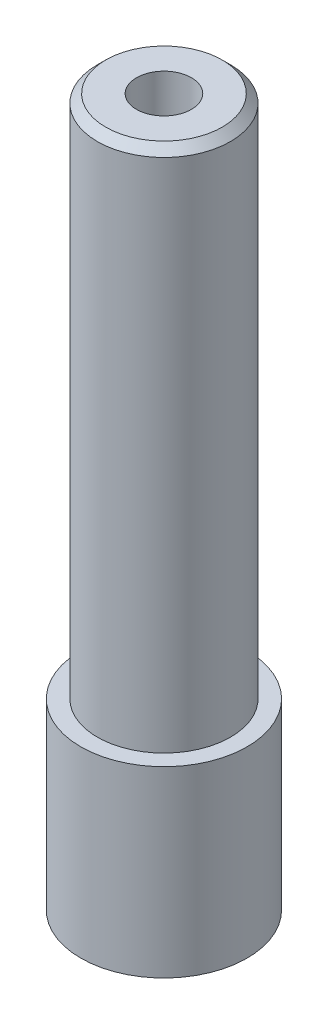
ISO-10303-21;
HEADER;
FILE_DESCRIPTION(('STEP AP214'),'2;1');
FILE_NAME('part.step','',(''),(''),'','','');
FILE_SCHEMA(('AUTOMOTIVE_DESIGN { 1 0 10303 214 1 1 1 1 }'));
ENDSEC;
DATA;
#1=APPLICATION_CONTEXT('core data for automotive mechanical design processes');
#2=APPLICATION_PROTOCOL_DEFINITION('international standard','automotive_design',2000,#1);
#3=PRODUCT_CONTEXT('',#1,'mechanical');
#4=PRODUCT('Part','Part','',(#3));
#5=PRODUCT_RELATED_PRODUCT_CATEGORY('part','',(#4));
#6=PRODUCT_DEFINITION_FORMATION('','',#4);
#7=PRODUCT_DEFINITION_CONTEXT('part definition',#1,'design');
#8=PRODUCT_DEFINITION('design','',#6,#7);
#9=PRODUCT_DEFINITION_SHAPE('','',#8);
#10=(LENGTH_UNIT() NAMED_UNIT(*) SI_UNIT(.MILLI.,.METRE.));
#11=(NAMED_UNIT(*) PLANE_ANGLE_UNIT() SI_UNIT($,.RADIAN.));
#12=(NAMED_UNIT(*) SI_UNIT($,.STERADIAN.) SOLID_ANGLE_UNIT());
#13=UNCERTAINTY_MEASURE_WITH_UNIT(LENGTH_MEASURE(1.E-05),#10,'distance_accuracy_value','');
#14=(GEOMETRIC_REPRESENTATION_CONTEXT(3) GLOBAL_UNCERTAINTY_ASSIGNED_CONTEXT((#13)) GLOBAL_UNIT_ASSIGNED_CONTEXT((#10,
#11,#12)) REPRESENTATION_CONTEXT('',''));
#15=CARTESIAN_POINT('',(0.,0.,0.));
#16=DIRECTION('',(0.,0.,1.));
#17=DIRECTION('',(1.,0.,0.));
#18=AXIS2_PLACEMENT_3D('',#15,#16,#17);
#19=CARTESIAN_POINT('',(0.,43.836200342449,0.));
#20=DIRECTION('',(0.,-1.,0.));
#21=DIRECTION('',(0.,0.,-1.));
#22=AXIS2_PLACEMENT_3D('',#19,#20,#21);
#23=CYLINDRICAL_SURFACE('',#22,8.);
#24=CARTESIAN_POINT('',(0.,42.836200342449,0.));
#25=DIRECTION('',(0.,1.,0.));
#26=DIRECTION('',(0.,0.,1.));
#27=AXIS2_PLACEMENT_3D('',#24,#25,#26);
#28=CIRCLE('',#27,8.);
#29=CARTESIAN_POINT('',(0.,42.836200342449,8.));
#30=VERTEX_POINT('',#29);
#31=EDGE_CURVE('E10',#30,#30,#28,.F.);
#32=ORIENTED_EDGE('',*,*,#31,.T.);
#33=EDGE_LOOP('',(#32));
#34=FACE_BOUND('',#33,.T.);
#35=CARTESIAN_POINT('',(0.,-19.163799657551,0.));
#36=DIRECTION('',(0.,-1.,0.));
#37=DIRECTION('',(0.,0.,-1.));
#38=AXIS2_PLACEMENT_3D('',#35,#36,#37);
#39=CIRCLE('',#38,8.);
#40=CARTESIAN_POINT('',(0.,-19.163799657551,-8.));
#41=VERTEX_POINT('',#40);
#42=EDGE_CURVE('E53',#41,#41,#39,.T.);
#43=ORIENTED_EDGE('',*,*,#42,.F.);
#44=EDGE_LOOP('',(#43));
#45=FACE_BOUND('',#44,.T.);
#46=ADVANCED_FACE('F41',(#34,#45),#23,.T.);
#47=CARTESIAN_POINT('',(0.,43.836200342449,0.));
#48=DIRECTION('',(0.,1.,0.));
#49=DIRECTION('',(0.,0.,1.));
#50=AXIS2_PLACEMENT_3D('',#47,#48,#49);
#51=PLANE('',#50);
#52=CARTESIAN_POINT('',(0.,43.836200342449,0.));
#53=DIRECTION('',(0.,1.,0.));
#54=DIRECTION('',(0.,0.,1.));
#55=AXIS2_PLACEMENT_3D('',#52,#53,#54);
#56=CIRCLE('',#55,3.3);
#57=CARTESIAN_POINT('',(0.,43.836200342449,3.3));
#58=VERTEX_POINT('',#57);
#59=EDGE_CURVE('E70',#58,#58,#56,.T.);
#60=ORIENTED_EDGE('',*,*,#59,.F.);
#61=EDGE_LOOP('',(#60));
#62=FACE_BOUND('',#61,.T.);
#63=CARTESIAN_POINT('',(0.,43.836200342449,0.));
#64=DIRECTION('',(0.,1.,0.));
#65=DIRECTION('',(0.,0.,1.));
#66=AXIS2_PLACEMENT_3D('',#63,#64,#65);
#67=CIRCLE('',#66,6.99999999999998);
#68=CARTESIAN_POINT('',(0.,43.836200342449,6.99999999999998));
#69=VERTEX_POINT('',#68);
#70=EDGE_CURVE('E49',#69,#69,#67,.T.);
#71=ORIENTED_EDGE('',*,*,#70,.T.);
#72=EDGE_LOOP('',(#71));
#73=FACE_BOUND('',#72,.T.);
#74=ADVANCED_FACE('F90',(#62,#73),#51,.T.);
#75=CARTESIAN_POINT('',(0.,43.836200342449,0.));
#76=DIRECTION('',(0.,1.,0.));
#77=DIRECTION('',(0.,0.,1.));
#78=AXIS2_PLACEMENT_3D('',#75,#76,#77);
#79=CYLINDRICAL_SURFACE('',#78,10.);
#80=CARTESIAN_POINT('',(0.,-19.163799657551,0.));
#81=DIRECTION('',(0.,1.,0.));
#82=DIRECTION('',(0.,0.,1.));
#83=AXIS2_PLACEMENT_3D('',#80,#81,#82);
#84=CIRCLE('',#83,10.);
#85=CARTESIAN_POINT('',(0.,-19.163799657551,10.));
#86=VERTEX_POINT('',#85);
#87=EDGE_CURVE('E61',#86,#86,#84,.T.);
#88=ORIENTED_EDGE('',*,*,#87,.F.);
#89=EDGE_LOOP('',(#88));
#90=FACE_BOUND('',#89,.T.);
#91=CARTESIAN_POINT('',(0.,-41.163799657551,0.));
#92=DIRECTION('',(0.,1.,0.));
#93=DIRECTION('',(0.,0.,1.));
#94=AXIS2_PLACEMENT_3D('',#91,#92,#93);
#95=CIRCLE('',#94,10.);
#96=CARTESIAN_POINT('',(0.,-41.163799657551,10.));
#97=VERTEX_POINT('',#96);
#98=EDGE_CURVE('E58',#97,#97,#95,.T.);
#99=ORIENTED_EDGE('',*,*,#98,.T.);
#100=EDGE_LOOP('',(#99));
#101=FACE_BOUND('',#100,.T.);
#102=ADVANCED_FACE('F94',(#90,#101),#79,.T.);
#103=CARTESIAN_POINT('',(10.,-19.163799657551,0.));
#104=DIRECTION('',(0.,-1.,0.));
#105=DIRECTION('',(0.,0.,-1.));
#106=AXIS2_PLACEMENT_3D('',#103,#104,#105);
#107=PLANE('',#106);
#108=ORIENTED_EDGE('',*,*,#42,.T.);
#109=EDGE_LOOP('',(#108));
#110=FACE_BOUND('',#109,.T.);
#111=ORIENTED_EDGE('',*,*,#87,.T.);
#112=EDGE_LOOP('',(#111));
#113=FACE_BOUND('',#112,.T.);
#114=ADVANCED_FACE('F101',(#110,#113),#107,.F.);
#115=CARTESIAN_POINT('',(0.,-41.163799657551,0.));
#116=DIRECTION('',(0.,1.,0.));
#117=DIRECTION('',(0.,0.,1.));
#118=AXIS2_PLACEMENT_3D('',#115,#116,#117);
#119=PLANE('',#118);
#120=CARTESIAN_POINT('',(0.,-41.163799657551,0.));
#121=DIRECTION('',(0.,-1.,0.));
#122=DIRECTION('',(0.,0.,-1.));
#123=AXIS2_PLACEMENT_3D('',#120,#121,#122);
#124=CIRCLE('',#123,4.99999999999998);
#125=CARTESIAN_POINT('',(0.,-41.163799657551,-4.99999999999998));
#126=VERTEX_POINT('',#125);
#127=EDGE_CURVE('E67',#126,#126,#124,.T.);
#128=ORIENTED_EDGE('',*,*,#127,.F.);
#129=EDGE_LOOP('',(#128));
#130=FACE_BOUND('',#129,.T.);
#131=ORIENTED_EDGE('',*,*,#98,.F.);
#132=EDGE_LOOP('',(#131));
#133=FACE_BOUND('',#132,.T.);
#134=ADVANCED_FACE('F99',(#130,#133),#119,.F.);
#135=CARTESIAN_POINT('',(0.,43.836200342449,0.));
#136=DIRECTION('',(0.,-1.,0.));
#137=DIRECTION('',(0.,0.,-1.));
#138=AXIS2_PLACEMENT_3D('',#135,#136,#137);
#139=CONICAL_SURFACE('',#138,6.99999999999998,0.785398163397448);
#140=ORIENTED_EDGE('',*,*,#31,.F.);
#141=EDGE_LOOP('',(#140));
#142=FACE_BOUND('',#141,.T.);
#143=ORIENTED_EDGE('',*,*,#70,.F.);
#144=EDGE_LOOP('',(#143));
#145=FACE_BOUND('',#144,.T.);
#146=ADVANCED_FACE('F43',(#142,#145),#139,.T.);
#147=CARTESIAN_POINT('',(0.,-5.16379965755097,0.));
#148=DIRECTION('',(0.,-1.,0.));
#149=DIRECTION('',(0.,0.,-1.));
#150=AXIS2_PLACEMENT_3D('',#147,#148,#149);
#151=CONICAL_SURFACE('',#150,4.99999999999999,1.02974425867665);
#152=CARTESIAN_POINT('',(0.,-4.14233660520411,0.));
#153=DIRECTION('',(0.,-1.,0.));
#154=DIRECTION('',(0.,0.,-1.));
#155=AXIS2_PLACEMENT_3D('',#152,#153,#154);
#156=CIRCLE('',#155,3.29999999999999);
#157=CARTESIAN_POINT('',(0.,-4.14233660520411,-3.29999999999999));
#158=VERTEX_POINT('',#157);
#159=EDGE_CURVE('E45',#158,#158,#156,.F.);
#160=ORIENTED_EDGE('',*,*,#159,.T.);
#161=EDGE_LOOP('',(#160));
#162=FACE_BOUND('',#161,.T.);
#163=CARTESIAN_POINT('',(0.,-5.16379965755097,0.));
#164=DIRECTION('',(0.,-1.,0.));
#165=DIRECTION('',(0.,0.,-1.));
#166=AXIS2_PLACEMENT_3D('',#163,#164,#165);
#167=CIRCLE('',#166,4.99999999999999);
#168=CARTESIAN_POINT('',(0.,-5.16379965755097,-4.99999999999999));
#169=VERTEX_POINT('',#168);
#170=EDGE_CURVE('E64',#169,#169,#167,.T.);
#171=ORIENTED_EDGE('',*,*,#170,.T.);
#172=EDGE_LOOP('',(#171));
#173=FACE_BOUND('',#172,.T.);
#174=ADVANCED_FACE('F77',(#162,#173),#151,.F.);
#175=CARTESIAN_POINT('',(0.,-41.163799657551,0.));
#176=DIRECTION('',(0.,-1.,0.));
#177=DIRECTION('',(0.,0.,-1.));
#178=AXIS2_PLACEMENT_3D('',#175,#176,#177);
#179=CYLINDRICAL_SURFACE('',#178,4.99999999999999);
#180=ORIENTED_EDGE('',*,*,#170,.F.);
#181=EDGE_LOOP('',(#180));
#182=FACE_BOUND('',#181,.T.);
#183=ORIENTED_EDGE('',*,*,#127,.T.);
#184=EDGE_LOOP('',(#183));
#185=FACE_BOUND('',#184,.T.);
#186=ADVANCED_FACE('F82',(#182,#185),#179,.F.);
#187=CARTESIAN_POINT('',(0.,43.836200342449,0.));
#188=DIRECTION('',(0.,1.,0.));
#189=DIRECTION('',(0.,0.,1.));
#190=AXIS2_PLACEMENT_3D('',#187,#188,#189);
#191=CYLINDRICAL_SURFACE('',#190,3.29999999999999);
#192=ORIENTED_EDGE('',*,*,#59,.T.);
#193=EDGE_LOOP('',(#192));
#194=FACE_BOUND('',#193,.T.);
#195=ORIENTED_EDGE('',*,*,#159,.F.);
#196=EDGE_LOOP('',(#195));
#197=FACE_BOUND('',#196,.T.);
#198=ADVANCED_FACE('F80',(#194,#197),#191,.F.);
#199=CLOSED_SHELL('',(#46,#74,#102,#114,#134,#146,#174,#186,#198));
#200=MANIFOLD_SOLID_BREP('B2',#199);
#201=ADVANCED_BREP_SHAPE_REPRESENTATION('',(#18,#200),#14);
#202=SHAPE_DEFINITION_REPRESENTATION(#9,#201);
ENDSEC;
END-ISO-10303-21;
